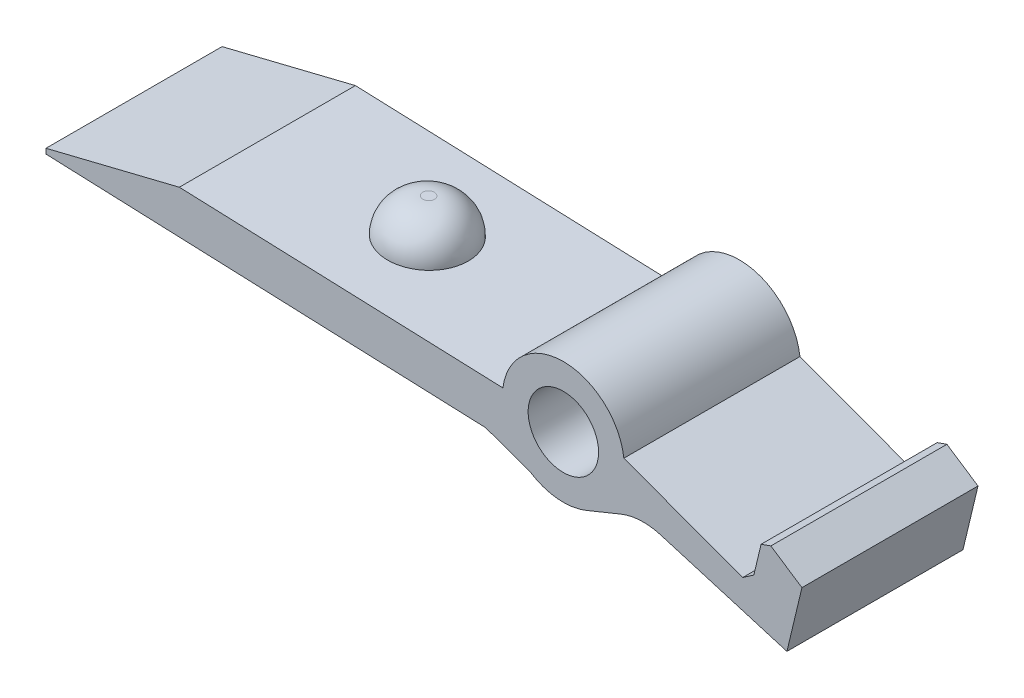
ISO-10303-21;
HEADER;
FILE_DESCRIPTION(('STEP AP214'),'2;1');
FILE_NAME('part.step','',(''),(''),'','','');
FILE_SCHEMA(('AUTOMOTIVE_DESIGN { 1 0 10303 214 1 1 1 1 }'));
ENDSEC;
DATA;
#1=APPLICATION_CONTEXT('core data for automotive mechanical design processes');
#2=APPLICATION_PROTOCOL_DEFINITION('international standard','automotive_design',2000,#1);
#3=PRODUCT_CONTEXT('',#1,'mechanical');
#4=PRODUCT('Part','Part','',(#3));
#5=PRODUCT_RELATED_PRODUCT_CATEGORY('part','',(#4));
#6=PRODUCT_DEFINITION_FORMATION('','',#4);
#7=PRODUCT_DEFINITION_CONTEXT('part definition',#1,'design');
#8=PRODUCT_DEFINITION('design','',#6,#7);
#9=PRODUCT_DEFINITION_SHAPE('','',#8);
#10=(LENGTH_UNIT() NAMED_UNIT(*) SI_UNIT(.MILLI.,.METRE.));
#11=(NAMED_UNIT(*) PLANE_ANGLE_UNIT() SI_UNIT($,.RADIAN.));
#12=(NAMED_UNIT(*) SI_UNIT($,.STERADIAN.) SOLID_ANGLE_UNIT());
#13=UNCERTAINTY_MEASURE_WITH_UNIT(LENGTH_MEASURE(1.E-05),#10,'distance_accuracy_value','');
#14=(GEOMETRIC_REPRESENTATION_CONTEXT(3) GLOBAL_UNCERTAINTY_ASSIGNED_CONTEXT((#13)) GLOBAL_UNIT_ASSIGNED_CONTEXT((#10,
#11,#12)) REPRESENTATION_CONTEXT('',''));
#15=CARTESIAN_POINT('',(0.,0.,0.));
#16=DIRECTION('',(0.,0.,1.));
#17=DIRECTION('',(1.,0.,0.));
#18=AXIS2_PLACEMENT_3D('',#15,#16,#17);
#19=CARTESIAN_POINT('',(10.2419023037273,-5.71231585271032,7.5));
#20=DIRECTION('',(0.,0.,1.));
#21=DIRECTION('',(1.,0.,0.));
#22=AXIS2_PLACEMENT_3D('',#19,#20,#21);
#23=PLANE('',#22);
#24=DIRECTION('',(-0.232790671797783,-0.972526864988282,0.));
#25=VECTOR('',#24,1.);
#26=CARTESIAN_POINT('',(20.4054963845294,-6.3750265460883,7.5));
#27=LINE('',#26,#25);
#28=CARTESIAN_POINT('',(20.4054963845294,-6.3750265460883,7.5));
#29=VERTEX_POINT('',#28);
#30=CARTESIAN_POINT('',(19.7657422409588,-9.04771994400277,7.5));
#31=VERTEX_POINT('',#30);
#32=EDGE_CURVE('E153',#29,#31,#27,.T.);
#33=ORIENTED_EDGE('',*,*,#32,.F.);
#34=DIRECTION('',(-0.834023417006575,0.551729045714177,0.));
#35=VECTOR('',#34,1.);
#36=CARTESIAN_POINT('',(20.8493394945539,-6.66864076668123,7.5));
#37=LINE('',#36,#35);
#38=CARTESIAN_POINT('',(19.08131789759,-5.49904666583926,7.5));
#39=VERTEX_POINT('',#38);
#40=EDGE_CURVE('E303',#29,#39,#37,.T.);
#41=ORIENTED_EDGE('',*,*,#40,.T.);
#42=DIRECTION('',(-0.943209072169113,-0.332199708274829,0.));
#43=VECTOR('',#42,1.);
#44=CARTESIAN_POINT('',(18.6650241613412,-5.64566596989286,7.5));
#45=LINE('',#44,#43);
#46=CARTESIAN_POINT('',(18.6650241613412,-5.64566596989286,7.5));
#47=VERTEX_POINT('',#46);
#48=EDGE_CURVE('E305',#39,#47,#45,.T.);
#49=ORIENTED_EDGE('',*,*,#48,.T.);
#50=DIRECTION('',(-0.232790671797783,-0.972526864988282,0.));
#51=VECTOR('',#50,1.);
#52=CARTESIAN_POINT('',(18.3566850281255,-6.9338107579281,7.5));
#53=LINE('',#52,#51);
#54=CARTESIAN_POINT('',(18.3566850281255,-6.9338107579281,7.5));
#55=VERTEX_POINT('',#54);
#56=EDGE_CURVE('E307',#47,#55,#53,.T.);
#57=ORIENTED_EDGE('',*,*,#56,.T.);
#58=DIRECTION('',(-0.821037743642754,-0.570873912097948,0.));
#59=VECTOR('',#58,1.);
#60=CARTESIAN_POINT('',(18.3566850281255,-6.9338107579281,7.5));
#61=LINE('',#60,#59);
#62=CARTESIAN_POINT('',(17.8812261680362,-7.26440099157134,7.5));
#63=VERTEX_POINT('',#62);
#64=EDGE_CURVE('E309',#55,#63,#61,.T.);
#65=ORIENTED_EDGE('',*,*,#64,.T.);
#66=DIRECTION('',(-0.937906630998018,0.346887808275165,0.));
#67=VECTOR('',#66,1.);
#68=CARTESIAN_POINT('',(17.8812261680362,-7.26440099157134,7.5));
#69=LINE('',#68,#67);
#70=CARTESIAN_POINT('',(12.8205265545409,-5.39268483215325,7.5));
#71=VERTEX_POINT('',#70);
#72=EDGE_CURVE('E311',#63,#71,#69,.T.);
#73=ORIENTED_EDGE('',*,*,#72,.T.);
#74=CARTESIAN_POINT('',(10.2419023037273,-5.71231585271032,7.5));
#75=DIRECTION('',(0.,0.,1.));
#76=DIRECTION('',(1.,0.,0.));
#77=AXIS2_PLACEMENT_3D('',#74,#75,#76);
#78=CIRCLE('',#77,2.59835852341167);
#79=CARTESIAN_POINT('',(7.66525276093975,-5.37713806430758,7.5));
#80=VERTEX_POINT('',#79);
#81=EDGE_CURVE('E313',#71,#80,#78,.T.);
#82=ORIENTED_EDGE('',*,*,#81,.T.);
#83=DIRECTION('',(-0.999307880235137,0.037198931435694,0.));
#84=VECTOR('',#83,1.);
#85=CARTESIAN_POINT('',(-11.1132945965829,-4.6781123591865,7.5));
#86=LINE('',#85,#84);
#87=CARTESIAN_POINT('',(-6.11675519540717,-4.86410701636497,7.5));
#88=VERTEX_POINT('',#87);
#89=EDGE_CURVE('E280',#80,#88,#86,.T.);
#90=ORIENTED_EDGE('',*,*,#89,.T.);
#91=DIRECTION('',(0.970849802819506,0.23968867383614,0.));
#92=VECTOR('',#91,1.);
#93=CARTESIAN_POINT('',(9.10470698807026,-1.10614973604304,7.5));
#94=LINE('',#93,#92);
#95=CARTESIAN_POINT('',(-11.7973837905488,-6.26657146613968,7.5));
#96=VERTEX_POINT('',#95);
#97=EDGE_CURVE('E61',#88,#96,#94,.F.);
#98=ORIENTED_EDGE('',*,*,#97,.T.);
#99=DIRECTION('',(0.,-1.,0.));
#100=VECTOR('',#99,1.);
#101=CARTESIAN_POINT('',(-11.7973837905488,-6.48268895577637,7.5));
#102=LINE('',#101,#100);
#103=CARTESIAN_POINT('',(-11.7973837905488,-6.48268895577637,7.5));
#104=VERTEX_POINT('',#103);
#105=EDGE_CURVE('E277',#96,#104,#102,.T.);
#106=ORIENTED_EDGE('',*,*,#105,.T.);
#107=DIRECTION('',(0.999240900935587,-0.038956666918992,0.));
#108=VECTOR('',#107,1.);
#109=CARTESIAN_POINT('',(6.93217204194058,-7.21288431449697,7.5));
#110=LINE('',#109,#108);
#111=CARTESIAN_POINT('',(6.93217204194058,-7.21288431449697,7.5));
#112=VERTEX_POINT('',#111);
#113=EDGE_CURVE('E274',#104,#112,#110,.T.);
#114=ORIENTED_EDGE('',*,*,#113,.T.);
#115=DIRECTION('',(0.942262573655386,-0.334874965156143,0.));
#116=VECTOR('',#115,1.);
#117=CARTESIAN_POINT('',(8.80911881044142,-7.87994093042866,7.5));
#118=LINE('',#117,#116);
#119=CARTESIAN_POINT('',(8.80911881044142,-7.87994093042866,7.5));
#120=VERTEX_POINT('',#119);
#121=EDGE_CURVE('E206',#112,#120,#118,.T.);
#122=ORIENTED_EDGE('',*,*,#121,.T.);
#123=CARTESIAN_POINT('',(10.2419023037273,-5.71231585271032,7.5));
#124=DIRECTION('',(0.,0.,1.));
#125=DIRECTION('',(1.,0.,0.));
#126=AXIS2_PLACEMENT_3D('',#123,#124,#125);
#127=CIRCLE('',#126,2.59835852341167);
#128=CARTESIAN_POINT('',(11.22170858302,-8.11885832506453,7.5));
#129=VERTEX_POINT('',#128);
#130=EDGE_CURVE('E201',#120,#129,#127,.T.);
#131=ORIENTED_EDGE('',*,*,#130,.T.);
#132=DIRECTION('',(0.926177989169252,0.377086637761671,0.));
#133=VECTOR('',#132,1.);
#134=CARTESIAN_POINT('',(11.22170858302,-8.11885832506453,7.5));
#135=LINE('',#134,#133);
#136=CARTESIAN_POINT('',(12.6937650142964,-7.51952124649355,7.5));
#137=VERTEX_POINT('',#136);
#138=EDGE_CURVE('E298',#129,#137,#135,.T.);
#139=ORIENTED_EDGE('',*,*,#138,.T.);
#140=CARTESIAN_POINT('',(13.651565074211,-9.87201333898345,7.5));
#141=DIRECTION('',(0.,0.,1.));
#142=DIRECTION('',(1.,0.,0.));
#143=AXIS2_PLACEMENT_3D('',#140,#141,#142);
#144=CIRCLE('',#143,2.54);
#145=CARTESIAN_POINT('',(14.3786469899504,-7.43830179325648,7.5));
#146=VERTEX_POINT('',#145);
#147=EDGE_CURVE('E238',#137,#146,#144,.F.);
#148=ORIENTED_EDGE('',*,*,#147,.T.);
#149=DIRECTION('',(0.958154151861009,-0.286252722732048,0.));
#150=VECTOR('',#149,1.);
#151=CARTESIAN_POINT('',(20.2455545730957,-9.19106596636028,7.5));
#152=LINE('',#151,#150);
#153=EDGE_CURVE('E301',#146,#31,#152,.T.);
#154=ORIENTED_EDGE('',*,*,#153,.T.);
#155=EDGE_LOOP('',(#33,#41,#49,#57,#65,#73,#82,#90,#98,#106,#114,#122,#131,#139,#148,#154));
#156=FACE_BOUND('',#155,.T.);
#157=CARTESIAN_POINT('',(10.2419023037273,-5.71231585271032,7.5));
#158=DIRECTION('',(0.,0.,1.));
#159=DIRECTION('',(1.,0.,0.));
#160=AXIS2_PLACEMENT_3D('',#157,#158,#159);
#161=CIRCLE('',#160,1.5);
#162=CARTESIAN_POINT('',(11.7419023037273,-5.71231585271032,7.5));
#163=VERTEX_POINT('',#162);
#164=EDGE_CURVE('E284',#163,#163,#161,.T.);
#165=ORIENTED_EDGE('',*,*,#164,.F.);
#166=EDGE_LOOP('',(#165));
#167=FACE_BOUND('',#166,.T.);
#168=ADVANCED_FACE('F38',(#156,#167),#23,.T.);
#169=CARTESIAN_POINT('',(10.2419023037273,-5.71231585271032,0.));
#170=DIRECTION('',(0.,0.,1.));
#171=DIRECTION('',(1.,0.,0.));
#172=AXIS2_PLACEMENT_3D('',#169,#170,#171);
#173=PLANE('',#172);
#174=DIRECTION('',(-0.834023417006575,0.551729045714177,0.));
#175=VECTOR('',#174,1.);
#176=CARTESIAN_POINT('',(20.8493394945539,-6.66864076668123,0.));
#177=LINE('',#176,#175);
#178=CARTESIAN_POINT('',(20.4054963845294,-6.3750265460883,0.));
#179=VERTEX_POINT('',#178);
#180=CARTESIAN_POINT('',(19.08131789759,-5.49904666583926,0.));
#181=VERTEX_POINT('',#180);
#182=EDGE_CURVE('E168',#179,#181,#177,.T.);
#183=ORIENTED_EDGE('',*,*,#182,.F.);
#184=DIRECTION('',(-0.232790671797783,-0.972526864988282,0.));
#185=VECTOR('',#184,1.);
#186=CARTESIAN_POINT('',(20.4054963845294,-6.3750265460883,0.));
#187=LINE('',#186,#185);
#188=CARTESIAN_POINT('',(19.7657422409588,-9.04771994400277,0.));
#189=VERTEX_POINT('',#188);
#190=EDGE_CURVE('E53',#179,#189,#187,.T.);
#191=ORIENTED_EDGE('',*,*,#190,.T.);
#192=DIRECTION('',(0.958154151861009,-0.286252722732048,0.));
#193=VECTOR('',#192,1.);
#194=CARTESIAN_POINT('',(20.2455545730957,-9.19106596636028,0.));
#195=LINE('',#194,#193);
#196=CARTESIAN_POINT('',(14.3786469899504,-7.43830179325648,0.));
#197=VERTEX_POINT('',#196);
#198=EDGE_CURVE('E166',#197,#189,#195,.T.);
#199=ORIENTED_EDGE('',*,*,#198,.F.);
#200=CARTESIAN_POINT('',(13.651565074211,-9.87201333898345,0.));
#201=DIRECTION('',(0.,0.,1.));
#202=DIRECTION('',(1.,0.,0.));
#203=AXIS2_PLACEMENT_3D('',#200,#201,#202);
#204=CIRCLE('',#203,2.54);
#205=CARTESIAN_POINT('',(12.6937650142964,-7.51952124649355,0.));
#206=VERTEX_POINT('',#205);
#207=EDGE_CURVE('E236',#197,#206,#204,.T.);
#208=ORIENTED_EDGE('',*,*,#207,.T.);
#209=DIRECTION('',(0.926177989169252,0.377086637761671,0.));
#210=VECTOR('',#209,1.);
#211=CARTESIAN_POINT('',(11.22170858302,-8.11885832506453,0.));
#212=LINE('',#211,#210);
#213=CARTESIAN_POINT('',(11.22170858302,-8.11885832506453,0.));
#214=VERTEX_POINT('',#213);
#215=EDGE_CURVE('E174',#214,#206,#212,.T.);
#216=ORIENTED_EDGE('',*,*,#215,.F.);
#217=CARTESIAN_POINT('',(10.2419023037273,-5.71231585271032,0.));
#218=DIRECTION('',(0.,0.,1.));
#219=DIRECTION('',(1.,0.,0.));
#220=AXIS2_PLACEMENT_3D('',#217,#218,#219);
#221=CIRCLE('',#220,2.59835852341167);
#222=CARTESIAN_POINT('',(8.80911881044142,-7.87994093042866,0.));
#223=VERTEX_POINT('',#222);
#224=EDGE_CURVE('E179',#223,#214,#221,.T.);
#225=ORIENTED_EDGE('',*,*,#224,.F.);
#226=DIRECTION('',(0.942262573655386,-0.334874965156143,0.));
#227=VECTOR('',#226,1.);
#228=CARTESIAN_POINT('',(8.80911881044142,-7.87994093042866,0.));
#229=LINE('',#228,#227);
#230=CARTESIAN_POINT('',(6.93217204194058,-7.21288431449697,0.));
#231=VERTEX_POINT('',#230);
#232=EDGE_CURVE('E199',#231,#223,#229,.T.);
#233=ORIENTED_EDGE('',*,*,#232,.F.);
#234=DIRECTION('',(0.999240900935587,-0.038956666918992,0.));
#235=VECTOR('',#234,1.);
#236=CARTESIAN_POINT('',(6.93217204194058,-7.21288431449697,0.));
#237=LINE('',#236,#235);
#238=CARTESIAN_POINT('',(-11.7973837905488,-6.48268895577637,0.));
#239=VERTEX_POINT('',#238);
#240=EDGE_CURVE('E197',#239,#231,#237,.T.);
#241=ORIENTED_EDGE('',*,*,#240,.F.);
#242=DIRECTION('',(0.,-1.,0.));
#243=VECTOR('',#242,1.);
#244=CARTESIAN_POINT('',(-11.7973837905488,-6.48268895577637,0.));
#245=LINE('',#244,#243);
#246=CARTESIAN_POINT('',(-11.7973837905488,-6.26657146613968,0.));
#247=VERTEX_POINT('',#246);
#248=EDGE_CURVE('E195',#247,#239,#245,.T.);
#249=ORIENTED_EDGE('',*,*,#248,.F.);
#250=DIRECTION('',(-0.970849802819506,-0.23968867383614,0.));
#251=VECTOR('',#250,1.);
#252=CARTESIAN_POINT('',(-12.9982235465139,-6.56304130911757,0.));
#253=LINE('',#252,#251);
#254=CARTESIAN_POINT('',(-6.11675519540717,-4.86410701636497,0.));
#255=VERTEX_POINT('',#254);
#256=EDGE_CURVE('E242',#247,#255,#253,.F.);
#257=ORIENTED_EDGE('',*,*,#256,.T.);
#258=DIRECTION('',(-0.999307880235137,0.037198931435694,0.));
#259=VECTOR('',#258,1.);
#260=CARTESIAN_POINT('',(-11.1132945965829,-4.6781123591865,0.));
#261=LINE('',#260,#259);
#262=CARTESIAN_POINT('',(7.66525276093975,-5.37713806430758,0.));
#263=VERTEX_POINT('',#262);
#264=EDGE_CURVE('E192',#263,#255,#261,.T.);
#265=ORIENTED_EDGE('',*,*,#264,.F.);
#266=CARTESIAN_POINT('',(10.2419023037273,-5.71231585271032,0.));
#267=DIRECTION('',(0.,0.,1.));
#268=DIRECTION('',(1.,0.,0.));
#269=AXIS2_PLACEMENT_3D('',#266,#267,#268);
#270=CIRCLE('',#269,2.59835852341167);
#271=CARTESIAN_POINT('',(12.8205265545409,-5.39268483215325,0.));
#272=VERTEX_POINT('',#271);
#273=EDGE_CURVE('E190',#272,#263,#270,.T.);
#274=ORIENTED_EDGE('',*,*,#273,.F.);
#275=DIRECTION('',(-0.937906630998018,0.346887808275165,0.));
#276=VECTOR('',#275,1.);
#277=CARTESIAN_POINT('',(17.8812261680362,-7.26440099157134,0.));
#278=LINE('',#277,#276);
#279=CARTESIAN_POINT('',(17.8812261680362,-7.26440099157134,0.));
#280=VERTEX_POINT('',#279);
#281=EDGE_CURVE('E188',#280,#272,#278,.T.);
#282=ORIENTED_EDGE('',*,*,#281,.F.);
#283=DIRECTION('',(-0.821037743642754,-0.570873912097948,0.));
#284=VECTOR('',#283,1.);
#285=CARTESIAN_POINT('',(18.3566850281255,-6.9338107579281,0.));
#286=LINE('',#285,#284);
#287=CARTESIAN_POINT('',(18.3566850281255,-6.9338107579281,0.));
#288=VERTEX_POINT('',#287);
#289=EDGE_CURVE('E186',#288,#280,#286,.T.);
#290=ORIENTED_EDGE('',*,*,#289,.F.);
#291=DIRECTION('',(-0.232790671797783,-0.972526864988282,0.));
#292=VECTOR('',#291,1.);
#293=CARTESIAN_POINT('',(18.3566850281255,-6.9338107579281,0.));
#294=LINE('',#293,#292);
#295=CARTESIAN_POINT('',(18.6650241613412,-5.64566596989286,0.));
#296=VERTEX_POINT('',#295);
#297=EDGE_CURVE('E184',#296,#288,#294,.T.);
#298=ORIENTED_EDGE('',*,*,#297,.F.);
#299=DIRECTION('',(-0.943209072169113,-0.332199708274829,0.));
#300=VECTOR('',#299,1.);
#301=CARTESIAN_POINT('',(18.6650241613412,-5.64566596989286,0.));
#302=LINE('',#301,#300);
#303=EDGE_CURVE('E176',#181,#296,#302,.T.);
#304=ORIENTED_EDGE('',*,*,#303,.F.);
#305=EDGE_LOOP('',(#183,#191,#199,#208,#216,#225,#233,#241,#249,#257,#265,#274,#282,#290,#298,#304));
#306=FACE_BOUND('',#305,.T.);
#307=CARTESIAN_POINT('',(10.2419023037273,-5.71231585271032,0.));
#308=DIRECTION('',(0.,0.,1.));
#309=DIRECTION('',(1.,0.,0.));
#310=AXIS2_PLACEMENT_3D('',#307,#308,#309);
#311=CIRCLE('',#310,1.5);
#312=CARTESIAN_POINT('',(11.7419023037273,-5.71231585271032,0.));
#313=VERTEX_POINT('',#312);
#314=EDGE_CURVE('E158',#313,#313,#311,.T.);
#315=ORIENTED_EDGE('',*,*,#314,.T.);
#316=EDGE_LOOP('',(#315));
#317=FACE_BOUND('',#316,.T.);
#318=ADVANCED_FACE('F164',(#306,#317),#173,.F.);
#319=CARTESIAN_POINT('',(10.2419023037273,-5.71231585271032,7.5));
#320=DIRECTION('',(0.,0.,-1.));
#321=DIRECTION('',(-1.,0.,0.));
#322=AXIS2_PLACEMENT_3D('',#319,#320,#321);
#323=CYLINDRICAL_SURFACE('',#322,2.59835852341167);
#324=ORIENTED_EDGE('',*,*,#224,.T.);
#325=DIRECTION('',(0.,0.,-1.));
#326=VECTOR('',#325,1.);
#327=CARTESIAN_POINT('',(11.22170858302,-8.11885832506453,7.5));
#328=LINE('',#327,#326);
#329=EDGE_CURVE('E230',#129,#214,#328,.T.);
#330=ORIENTED_EDGE('',*,*,#329,.F.);
#331=ORIENTED_EDGE('',*,*,#130,.F.);
#332=DIRECTION('',(0.,0.,-1.));
#333=VECTOR('',#332,1.);
#334=CARTESIAN_POINT('',(8.80911881044142,-7.87994093042866,7.5));
#335=LINE('',#334,#333);
#336=EDGE_CURVE('E202',#120,#223,#335,.T.);
#337=ORIENTED_EDGE('',*,*,#336,.T.);
#338=EDGE_LOOP('',(#324,#330,#331,#337));
#339=FACE_BOUND('',#338,.T.);
#340=ADVANCED_FACE('F348',(#339),#323,.T.);
#341=CARTESIAN_POINT('',(11.22170858302,-8.11885832506453,7.5));
#342=DIRECTION('',(-0.377086637761671,0.926177989169252,0.));
#343=DIRECTION('',(-0.926177989169252,-0.377086637761671,0.));
#344=AXIS2_PLACEMENT_3D('',#341,#342,#343);
#345=PLANE('',#344);
#346=ORIENTED_EDGE('',*,*,#215,.T.);
#347=DIRECTION('',(0.,0.,-1.));
#348=VECTOR('',#347,1.);
#349=CARTESIAN_POINT('',(12.6937650142964,-7.51952124649355,7.5));
#350=LINE('',#349,#348);
#351=EDGE_CURVE('E234',#206,#137,#350,.F.);
#352=ORIENTED_EDGE('',*,*,#351,.T.);
#353=ORIENTED_EDGE('',*,*,#138,.F.);
#354=ORIENTED_EDGE('',*,*,#329,.T.);
#355=EDGE_LOOP('',(#346,#352,#353,#354));
#356=FACE_BOUND('',#355,.T.);
#357=ADVANCED_FACE('F346',(#356),#345,.F.);
#358=CARTESIAN_POINT('',(20.2455545730957,-9.19106596636028,7.5));
#359=DIRECTION('',(0.286252722732048,0.958154151861009,0.));
#360=DIRECTION('',(-0.958154151861009,0.286252722732048,0.));
#361=AXIS2_PLACEMENT_3D('',#358,#359,#360);
#362=PLANE('',#361);
#363=ORIENTED_EDGE('',*,*,#198,.T.);
#364=DIRECTION('',(0.,0.,1.));
#365=VECTOR('',#364,1.);
#366=CARTESIAN_POINT('',(19.7657422409588,-9.04771994400277,0.));
#367=LINE('',#366,#365);
#368=EDGE_CURVE('E150',#189,#31,#367,.T.);
#369=ORIENTED_EDGE('',*,*,#368,.T.);
#370=ORIENTED_EDGE('',*,*,#153,.F.);
#371=DIRECTION('',(0.,0.,-1.));
#372=VECTOR('',#371,1.);
#373=CARTESIAN_POINT('',(14.3786469899504,-7.43830179325648,0.));
#374=LINE('',#373,#372);
#375=EDGE_CURVE('E173',#146,#197,#374,.T.);
#376=ORIENTED_EDGE('',*,*,#375,.T.);
#377=EDGE_LOOP('',(#363,#369,#370,#376));
#378=FACE_BOUND('',#377,.T.);
#379=ADVANCED_FACE('F171',(#378),#362,.F.);
#380=CARTESIAN_POINT('',(20.8493394945539,-6.66864076668123,7.5));
#381=DIRECTION('',(-0.551729045714177,-0.834023417006575,0.));
#382=DIRECTION('',(0.834023417006575,-0.551729045714177,0.));
#383=AXIS2_PLACEMENT_3D('',#380,#381,#382);
#384=PLANE('',#383);
#385=ORIENTED_EDGE('',*,*,#40,.F.);
#386=DIRECTION('',(0.,0.,1.));
#387=VECTOR('',#386,1.);
#388=CARTESIAN_POINT('',(20.4054963845294,-6.3750265460883,0.));
#389=LINE('',#388,#387);
#390=EDGE_CURVE('E159',#179,#29,#389,.T.);
#391=ORIENTED_EDGE('',*,*,#390,.F.);
#392=ORIENTED_EDGE('',*,*,#182,.T.);
#393=DIRECTION('',(0.,0.,-1.));
#394=VECTOR('',#393,1.);
#395=CARTESIAN_POINT('',(19.08131789759,-5.49904666583926,7.5));
#396=LINE('',#395,#394);
#397=EDGE_CURVE('E227',#39,#181,#396,.T.);
#398=ORIENTED_EDGE('',*,*,#397,.F.);
#399=EDGE_LOOP('',(#385,#391,#392,#398));
#400=FACE_BOUND('',#399,.T.);
#401=ADVANCED_FACE('F339',(#400),#384,.F.);
#402=CARTESIAN_POINT('',(18.6650241613412,-5.64566596989286,7.5));
#403=DIRECTION('',(0.332199708274829,-0.943209072169113,0.));
#404=DIRECTION('',(0.943209072169113,0.332199708274829,0.));
#405=AXIS2_PLACEMENT_3D('',#402,#403,#404);
#406=PLANE('',#405);
#407=ORIENTED_EDGE('',*,*,#303,.T.);
#408=DIRECTION('',(0.,0.,-1.));
#409=VECTOR('',#408,1.);
#410=CARTESIAN_POINT('',(18.6650241613412,-5.64566596989286,7.5));
#411=LINE('',#410,#409);
#412=EDGE_CURVE('E224',#47,#296,#411,.T.);
#413=ORIENTED_EDGE('',*,*,#412,.F.);
#414=ORIENTED_EDGE('',*,*,#48,.F.);
#415=ORIENTED_EDGE('',*,*,#397,.T.);
#416=EDGE_LOOP('',(#407,#413,#414,#415));
#417=FACE_BOUND('',#416,.T.);
#418=ADVANCED_FACE('F334',(#417),#406,.F.);
#419=CARTESIAN_POINT('',(18.3566850281255,-6.9338107579281,7.5));
#420=DIRECTION('',(0.972526864988283,-0.232790671797783,0.));
#421=DIRECTION('',(0.232790671797783,0.972526864988283,0.));
#422=AXIS2_PLACEMENT_3D('',#419,#420,#421);
#423=PLANE('',#422);
#424=ORIENTED_EDGE('',*,*,#297,.T.);
#425=DIRECTION('',(0.,0.,-1.));
#426=VECTOR('',#425,1.);
#427=CARTESIAN_POINT('',(18.3566850281255,-6.9338107579281,7.5));
#428=LINE('',#427,#426);
#429=EDGE_CURVE('E221',#55,#288,#428,.T.);
#430=ORIENTED_EDGE('',*,*,#429,.F.);
#431=ORIENTED_EDGE('',*,*,#56,.F.);
#432=ORIENTED_EDGE('',*,*,#412,.T.);
#433=EDGE_LOOP('',(#424,#430,#431,#432));
#434=FACE_BOUND('',#433,.T.);
#435=ADVANCED_FACE('F331',(#434),#423,.F.);
#436=CARTESIAN_POINT('',(18.3566850281255,-6.9338107579281,7.5));
#437=DIRECTION('',(0.570873912097948,-0.821037743642754,0.));
#438=DIRECTION('',(0.821037743642754,0.570873912097948,0.));
#439=AXIS2_PLACEMENT_3D('',#436,#437,#438);
#440=PLANE('',#439);
#441=ORIENTED_EDGE('',*,*,#289,.T.);
#442=DIRECTION('',(0.,0.,-1.));
#443=VECTOR('',#442,1.);
#444=CARTESIAN_POINT('',(17.8812261680362,-7.26440099157134,7.5));
#445=LINE('',#444,#443);
#446=EDGE_CURVE('E218',#63,#280,#445,.T.);
#447=ORIENTED_EDGE('',*,*,#446,.F.);
#448=ORIENTED_EDGE('',*,*,#64,.F.);
#449=ORIENTED_EDGE('',*,*,#429,.T.);
#450=EDGE_LOOP('',(#441,#447,#448,#449));
#451=FACE_BOUND('',#450,.T.);
#452=ADVANCED_FACE('F327',(#451),#440,.F.);
#453=CARTESIAN_POINT('',(17.8812261680362,-7.26440099157134,7.5));
#454=DIRECTION('',(-0.346887808275165,-0.937906630998018,0.));
#455=DIRECTION('',(0.937906630998018,-0.346887808275165,0.));
#456=AXIS2_PLACEMENT_3D('',#453,#454,#455);
#457=PLANE('',#456);
#458=ORIENTED_EDGE('',*,*,#281,.T.);
#459=DIRECTION('',(0.,0.,-1.));
#460=VECTOR('',#459,1.);
#461=CARTESIAN_POINT('',(12.8205265545409,-5.39268483215325,7.5));
#462=LINE('',#461,#460);
#463=EDGE_CURVE('E215',#71,#272,#462,.T.);
#464=ORIENTED_EDGE('',*,*,#463,.F.);
#465=ORIENTED_EDGE('',*,*,#72,.F.);
#466=ORIENTED_EDGE('',*,*,#446,.T.);
#467=EDGE_LOOP('',(#458,#464,#465,#466));
#468=FACE_BOUND('',#467,.T.);
#469=ADVANCED_FACE('F323',(#468),#457,.F.);
#470=CARTESIAN_POINT('',(10.2419023037273,-5.71231585271032,7.5));
#471=DIRECTION('',(0.,0.,-1.));
#472=DIRECTION('',(-1.,0.,0.));
#473=AXIS2_PLACEMENT_3D('',#470,#471,#472);
#474=CYLINDRICAL_SURFACE('',#473,2.59835852341167);
#475=ORIENTED_EDGE('',*,*,#273,.T.);
#476=DIRECTION('',(0.,0.,-1.));
#477=VECTOR('',#476,1.);
#478=CARTESIAN_POINT('',(7.66525276093975,-5.37713806430758,7.5));
#479=LINE('',#478,#477);
#480=EDGE_CURVE('E212',#80,#263,#479,.T.);
#481=ORIENTED_EDGE('',*,*,#480,.F.);
#482=ORIENTED_EDGE('',*,*,#81,.F.);
#483=ORIENTED_EDGE('',*,*,#463,.T.);
#484=EDGE_LOOP('',(#475,#481,#482,#483));
#485=FACE_BOUND('',#484,.T.);
#486=ADVANCED_FACE('F255',(#485),#474,.T.);
#487=CARTESIAN_POINT('',(-11.1132945965829,-4.6781123591865,7.5));
#488=DIRECTION('',(-0.037198931435694,-0.999307880235137,0.));
#489=DIRECTION('',(0.999307880235137,-0.037198931435694,0.));
#490=AXIS2_PLACEMENT_3D('',#487,#488,#489);
#491=PLANE('',#490);
#492=CARTESIAN_POINT('',(0.695623415058171,-5.11769573497395,3.75));
#493=DIRECTION('',(-0.037198931435694,-0.999307880235137,0.));
#494=DIRECTION('',(0.999307880235137,-0.037198931435694,0.));
#495=AXIS2_PLACEMENT_3D('',#492,#493,#494);
#496=CIRCLE('',#495,1.75);
#497=CARTESIAN_POINT('',(2.44441220546966,-5.18279386498642,3.75));
#498=VERTEX_POINT('',#497);
#499=EDGE_CURVE('E46',#498,#498,#496,.F.);
#500=ORIENTED_EDGE('',*,*,#499,.F.);
#501=EDGE_LOOP('',(#500));
#502=FACE_BOUND('',#501,.T.);
#503=ORIENTED_EDGE('',*,*,#264,.T.);
#504=DIRECTION('',(0.,0.,1.));
#505=VECTOR('',#504,1.);
#506=CARTESIAN_POINT('',(-6.11675519540717,-4.86410701636497,7.5));
#507=LINE('',#506,#505);
#508=EDGE_CURVE('E244',#255,#88,#507,.T.);
#509=ORIENTED_EDGE('',*,*,#508,.T.);
#510=ORIENTED_EDGE('',*,*,#89,.F.);
#511=ORIENTED_EDGE('',*,*,#480,.T.);
#512=EDGE_LOOP('',(#503,#509,#510,#511));
#513=FACE_BOUND('',#512,.T.);
#514=ADVANCED_FACE('F251',(#502,#513),#491,.F.);
#515=CARTESIAN_POINT('',(-11.7973837905488,-6.48268895577637,7.5));
#516=DIRECTION('',(1.,0.,0.));
#517=DIRECTION('',(0.,0.,-1.));
#518=AXIS2_PLACEMENT_3D('',#515,#516,#517);
#519=PLANE('',#518);
#520=ORIENTED_EDGE('',*,*,#105,.F.);
#521=DIRECTION('',(0.,0.,1.));
#522=VECTOR('',#521,1.);
#523=CARTESIAN_POINT('',(-11.7973837905488,-6.26657146613968,7.5));
#524=LINE('',#523,#522);
#525=EDGE_CURVE('E240',#96,#247,#524,.F.);
#526=ORIENTED_EDGE('',*,*,#525,.T.);
#527=ORIENTED_EDGE('',*,*,#248,.T.);
#528=DIRECTION('',(0.,0.,-1.));
#529=VECTOR('',#528,1.);
#530=CARTESIAN_POINT('',(-11.7973837905488,-6.48268895577637,7.5));
#531=LINE('',#530,#529);
#532=EDGE_CURVE('E209',#104,#239,#531,.T.);
#533=ORIENTED_EDGE('',*,*,#532,.F.);
#534=EDGE_LOOP('',(#520,#526,#527,#533));
#535=FACE_BOUND('',#534,.T.);
#536=ADVANCED_FACE('F254',(#535),#519,.F.);
#537=CARTESIAN_POINT('',(6.93217204194058,-7.21288431449697,7.5));
#538=DIRECTION('',(0.038956666918992,0.999240900935587,0.));
#539=DIRECTION('',(-0.999240900935587,0.038956666918992,0.));
#540=AXIS2_PLACEMENT_3D('',#537,#538,#539);
#541=PLANE('',#540);
#542=ORIENTED_EDGE('',*,*,#240,.T.);
#543=DIRECTION('',(0.,0.,-1.));
#544=VECTOR('',#543,1.);
#545=CARTESIAN_POINT('',(6.93217204194058,-7.21288431449697,7.5));
#546=LINE('',#545,#544);
#547=EDGE_CURVE('E205',#112,#231,#546,.T.);
#548=ORIENTED_EDGE('',*,*,#547,.F.);
#549=ORIENTED_EDGE('',*,*,#113,.F.);
#550=ORIENTED_EDGE('',*,*,#532,.T.);
#551=EDGE_LOOP('',(#542,#548,#549,#550));
#552=FACE_BOUND('',#551,.T.);
#553=ADVANCED_FACE('F272',(#552),#541,.F.);
#554=CARTESIAN_POINT('',(8.80911881044142,-7.87994093042866,7.5));
#555=DIRECTION('',(0.334874965156143,0.942262573655386,0.));
#556=DIRECTION('',(-0.942262573655386,0.334874965156143,0.));
#557=AXIS2_PLACEMENT_3D('',#554,#555,#556);
#558=PLANE('',#557);
#559=ORIENTED_EDGE('',*,*,#232,.T.);
#560=ORIENTED_EDGE('',*,*,#336,.F.);
#561=ORIENTED_EDGE('',*,*,#121,.F.);
#562=ORIENTED_EDGE('',*,*,#547,.T.);
#563=EDGE_LOOP('',(#559,#560,#561,#562));
#564=FACE_BOUND('',#563,.T.);
#565=ADVANCED_FACE('F351',(#564),#558,.F.);
#566=CARTESIAN_POINT('',(10.2419023037273,-5.71231585271032,7.5));
#567=DIRECTION('',(0.,0.,-1.));
#568=DIRECTION('',(-1.,0.,0.));
#569=AXIS2_PLACEMENT_3D('',#566,#567,#568);
#570=CYLINDRICAL_SURFACE('',#569,1.5);
#571=ORIENTED_EDGE('',*,*,#164,.T.);
#572=EDGE_LOOP('',(#571));
#573=FACE_BOUND('',#572,.T.);
#574=ORIENTED_EDGE('',*,*,#314,.F.);
#575=EDGE_LOOP('',(#574));
#576=FACE_BOUND('',#575,.T.);
#577=ADVANCED_FACE('F353',(#573,#576),#570,.F.);
#578=CARTESIAN_POINT('',(13.651565074211,-9.87201333898345,7.5));
#579=DIRECTION('',(0.,0.,1.));
#580=DIRECTION('',(1.,0.,0.));
#581=AXIS2_PLACEMENT_3D('',#578,#579,#580);
#582=CYLINDRICAL_SURFACE('',#581,2.54);
#583=ORIENTED_EDGE('',*,*,#147,.F.);
#584=ORIENTED_EDGE('',*,*,#351,.F.);
#585=ORIENTED_EDGE('',*,*,#207,.F.);
#586=ORIENTED_EDGE('',*,*,#375,.F.);
#587=EDGE_LOOP('',(#583,#584,#585,#586));
#588=FACE_BOUND('',#587,.T.);
#589=ADVANCED_FACE('F343',(#588),#582,.F.);
#590=CARTESIAN_POINT('',(-12.9982235465139,-6.56304130911757,7.5));
#591=DIRECTION('',(0.23968867383614,-0.970849802819505,0.));
#592=DIRECTION('',(0.,0.,-1.));
#593=AXIS2_PLACEMENT_3D('',#590,#591,#592);
#594=PLANE('',#593);
#595=ORIENTED_EDGE('',*,*,#97,.F.);
#596=ORIENTED_EDGE('',*,*,#508,.F.);
#597=ORIENTED_EDGE('',*,*,#256,.F.);
#598=ORIENTED_EDGE('',*,*,#525,.F.);
#599=EDGE_LOOP('',(#595,#596,#597,#598));
#600=FACE_BOUND('',#599,.T.);
#601=ADVANCED_FACE('F263',(#600),#594,.F.);
#602=CARTESIAN_POINT('',(0.751421812211712,-3.61873391462125,3.75));
#603=DIRECTION('',(0.037198931435694,0.999307880235137,0.));
#604=DIRECTION('',(-0.999307880235137,0.037198931435694,0.));
#605=AXIS2_PLACEMENT_3D('',#602,#603,#604);
#606=PLANE('',#605);
#607=CARTESIAN_POINT('',(0.751421812211712,-3.61873391462125,3.75));
#608=DIRECTION('',(0.037198931435694,0.999307880235137,0.));
#609=DIRECTION('',(-0.999307880235137,0.037198931435694,0.));
#610=AXIS2_PLACEMENT_3D('',#607,#608,#609);
#611=CIRCLE('',#610,0.249999952000001);
#612=CARTESIAN_POINT('',(0.501594890119706,-3.60943418354787,3.75));
#613=VERTEX_POINT('',#612);
#614=EDGE_CURVE('E11',#613,#613,#611,.T.);
#615=ORIENTED_EDGE('',*,*,#614,.T.);
#616=EDGE_LOOP('',(#615));
#617=FACE_BOUND('',#616,.T.);
#618=ADVANCED_FACE('F369',(#617),#606,.T.);
#619=CARTESIAN_POINT('',(0.695623413272623,-5.11769578294073,3.75));
#620=DIRECTION('',(0.037198931435694,0.999307880235137,0.));
#621=DIRECTION('',(-0.999307880235137,0.037198931435694,0.));
#622=AXIS2_PLACEMENT_3D('',#619,#620,#621);
#623=DEGENERATE_TOROIDAL_SURFACE('',#622,0.249999952000001,1.500000048,.T.);
#624=ORIENTED_EDGE('',*,*,#499,.T.);
#625=EDGE_LOOP('',(#624));
#626=FACE_BOUND('',#625,.T.);
#627=ORIENTED_EDGE('',*,*,#614,.F.);
#628=EDGE_LOOP('',(#627));
#629=FACE_BOUND('',#628,.T.);
#630=ADVANCED_FACE('F40',(#626,#629),#623,.T.);
#631=CARTESIAN_POINT('',(20.4054963845294,-6.3750265460883,0.));
#632=DIRECTION('',(-0.972526864988282,0.232790671797783,0.));
#633=DIRECTION('',(-0.232790671797783,-0.972526864988283,0.));
#634=AXIS2_PLACEMENT_3D('',#631,#632,#633);
#635=PLANE('',#634);
#636=ORIENTED_EDGE('',*,*,#32,.T.);
#637=ORIENTED_EDGE('',*,*,#368,.F.);
#638=ORIENTED_EDGE('',*,*,#190,.F.);
#639=ORIENTED_EDGE('',*,*,#390,.T.);
#640=EDGE_LOOP('',(#636,#637,#638,#639));
#641=FACE_BOUND('',#640,.T.);
#642=ADVANCED_FACE('F151',(#641),#635,.F.);
#643=CLOSED_SHELL('',(#168,#318,#340,#357,#379,#401,#418,#435,#452,#469,#486,#514,#536,#553,
#565,#577,#589,#601,#618,#630,#642));
#644=MANIFOLD_SOLID_BREP('B2',#643);
#645=ADVANCED_BREP_SHAPE_REPRESENTATION('',(#18,#644),#14);
#646=SHAPE_DEFINITION_REPRESENTATION(#9,#645);
ENDSEC;
END-ISO-10303-21;
